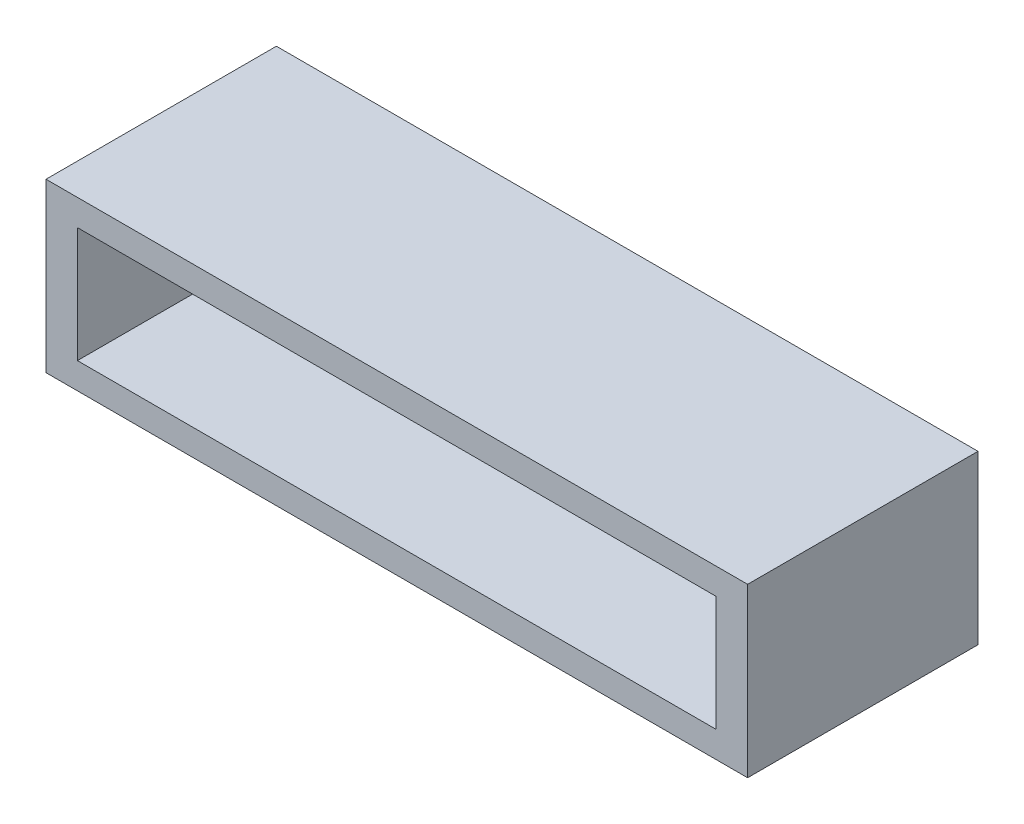
ISO-10303-21;
HEADER;
FILE_DESCRIPTION(('STEP AP214'),'2;1');
FILE_NAME('part.step','',(''),(''),'','','');
FILE_SCHEMA(('AUTOMOTIVE_DESIGN { 1 0 10303 214 1 1 1 1 }'));
ENDSEC;
DATA;
#1=APPLICATION_CONTEXT('core data for automotive mechanical design processes');
#2=APPLICATION_PROTOCOL_DEFINITION('international standard','automotive_design',2000,#1);
#3=PRODUCT_CONTEXT('',#1,'mechanical');
#4=PRODUCT('Part','Part','',(#3));
#5=PRODUCT_RELATED_PRODUCT_CATEGORY('part','',(#4));
#6=PRODUCT_DEFINITION_FORMATION('','',#4);
#7=PRODUCT_DEFINITION_CONTEXT('part definition',#1,'design');
#8=PRODUCT_DEFINITION('design','',#6,#7);
#9=PRODUCT_DEFINITION_SHAPE('','',#8);
#10=(LENGTH_UNIT() NAMED_UNIT(*) SI_UNIT(.MILLI.,.METRE.));
#11=(NAMED_UNIT(*) PLANE_ANGLE_UNIT() SI_UNIT($,.RADIAN.));
#12=(NAMED_UNIT(*) SI_UNIT($,.STERADIAN.) SOLID_ANGLE_UNIT());
#13=UNCERTAINTY_MEASURE_WITH_UNIT(LENGTH_MEASURE(1.E-05),#10,'distance_accuracy_value','');
#14=(GEOMETRIC_REPRESENTATION_CONTEXT(3) GLOBAL_UNCERTAINTY_ASSIGNED_CONTEXT((#13)) GLOBAL_UNIT_ASSIGNED_CONTEXT((#10,
#11,#12)) REPRESENTATION_CONTEXT('',''));
#15=CARTESIAN_POINT('',(0.,0.,0.));
#16=DIRECTION('',(0.,0.,1.));
#17=DIRECTION('',(1.,0.,0.));
#18=AXIS2_PLACEMENT_3D('',#15,#16,#17);
#19=CARTESIAN_POINT('',(0.,0.,22.));
#20=DIRECTION('',(0.,0.,1.));
#21=DIRECTION('',(1.,0.,0.));
#22=AXIS2_PLACEMENT_3D('',#19,#20,#21);
#23=PLANE('',#22);
#24=DIRECTION('',(0.,-1.,0.));
#25=VECTOR('',#24,1.);
#26=CARTESIAN_POINT('',(-33.5,-8.,22.));
#27=LINE('',#26,#25);
#28=CARTESIAN_POINT('',(-33.5,8.,22.));
#29=VERTEX_POINT('',#28);
#30=CARTESIAN_POINT('',(-33.5,-8.,22.));
#31=VERTEX_POINT('',#30);
#32=EDGE_CURVE('E138',#29,#31,#27,.T.);
#33=ORIENTED_EDGE('',*,*,#32,.T.);
#34=DIRECTION('',(1.,0.,0.));
#35=VECTOR('',#34,1.);
#36=CARTESIAN_POINT('',(33.5,-8.,22.));
#37=LINE('',#36,#35);
#38=CARTESIAN_POINT('',(33.5,-8.,22.));
#39=VERTEX_POINT('',#38);
#40=EDGE_CURVE('E141',#31,#39,#37,.T.);
#41=ORIENTED_EDGE('',*,*,#40,.T.);
#42=DIRECTION('',(0.,1.,0.));
#43=VECTOR('',#42,1.);
#44=CARTESIAN_POINT('',(33.5,-8.,22.));
#45=LINE('',#44,#43);
#46=CARTESIAN_POINT('',(33.5,8.,22.));
#47=VERTEX_POINT('',#46);
#48=EDGE_CURVE('E144',#39,#47,#45,.T.);
#49=ORIENTED_EDGE('',*,*,#48,.T.);
#50=DIRECTION('',(-1.,0.,0.));
#51=VECTOR('',#50,1.);
#52=CARTESIAN_POINT('',(33.5,8.,22.));
#53=LINE('',#52,#51);
#54=EDGE_CURVE('E146',#47,#29,#53,.T.);
#55=ORIENTED_EDGE('',*,*,#54,.T.);
#56=EDGE_LOOP('',(#33,#41,#49,#55));
#57=FACE_BOUND('',#56,.T.);
#58=DIRECTION('',(-1.,0.,0.));
#59=VECTOR('',#58,1.);
#60=CARTESIAN_POINT('',(-30.5,5.5,22.));
#61=LINE('',#60,#59);
#62=CARTESIAN_POINT('',(30.5,5.5,22.));
#63=VERTEX_POINT('',#62);
#64=CARTESIAN_POINT('',(-30.5,5.5,22.));
#65=VERTEX_POINT('',#64);
#66=EDGE_CURVE('E110',#63,#65,#61,.T.);
#67=ORIENTED_EDGE('',*,*,#66,.F.);
#68=DIRECTION('',(0.,1.,0.));
#69=VECTOR('',#68,1.);
#70=CARTESIAN_POINT('',(30.5,-5.5,22.));
#71=LINE('',#70,#69);
#72=CARTESIAN_POINT('',(30.5,-5.5,22.));
#73=VERTEX_POINT('',#72);
#74=EDGE_CURVE('E102',#73,#63,#71,.T.);
#75=ORIENTED_EDGE('',*,*,#74,.F.);
#76=DIRECTION('',(1.,0.,0.));
#77=VECTOR('',#76,1.);
#78=CARTESIAN_POINT('',(-30.5,-5.5,22.));
#79=LINE('',#78,#77);
#80=CARTESIAN_POINT('',(-30.5,-5.5,22.));
#81=VERTEX_POINT('',#80);
#82=EDGE_CURVE('E124',#81,#73,#79,.T.);
#83=ORIENTED_EDGE('',*,*,#82,.F.);
#84=DIRECTION('',(0.,-1.,0.));
#85=VECTOR('',#84,1.);
#86=CARTESIAN_POINT('',(-30.5,-5.5,22.));
#87=LINE('',#86,#85);
#88=EDGE_CURVE('E122',#65,#81,#87,.T.);
#89=ORIENTED_EDGE('',*,*,#88,.F.);
#90=EDGE_LOOP('',(#67,#75,#83,#89));
#91=FACE_BOUND('',#90,.T.);
#92=ADVANCED_FACE('F37',(#57,#91),#23,.T.);
#93=CARTESIAN_POINT('',(0.,0.,0.));
#94=DIRECTION('',(0.,0.,1.));
#95=DIRECTION('',(1.,0.,0.));
#96=AXIS2_PLACEMENT_3D('',#93,#94,#95);
#97=PLANE('',#96);
#98=DIRECTION('',(0.,-1.,0.));
#99=VECTOR('',#98,1.);
#100=CARTESIAN_POINT('',(-33.5,-8.,0.));
#101=LINE('',#100,#99);
#102=CARTESIAN_POINT('',(-33.5,8.,0.));
#103=VERTEX_POINT('',#102);
#104=CARTESIAN_POINT('',(-33.5,-8.,0.));
#105=VERTEX_POINT('',#104);
#106=EDGE_CURVE('E118',#103,#105,#101,.T.);
#107=ORIENTED_EDGE('',*,*,#106,.F.);
#108=DIRECTION('',(-1.,0.,0.));
#109=VECTOR('',#108,1.);
#110=CARTESIAN_POINT('',(33.5,8.,0.));
#111=LINE('',#110,#109);
#112=CARTESIAN_POINT('',(33.5,8.,0.));
#113=VERTEX_POINT('',#112);
#114=EDGE_CURVE('E142',#113,#103,#111,.T.);
#115=ORIENTED_EDGE('',*,*,#114,.F.);
#116=DIRECTION('',(0.,1.,0.));
#117=VECTOR('',#116,1.);
#118=CARTESIAN_POINT('',(33.5,-8.,0.));
#119=LINE('',#118,#117);
#120=CARTESIAN_POINT('',(33.5,-8.,0.));
#121=VERTEX_POINT('',#120);
#122=EDGE_CURVE('E153',#121,#113,#119,.T.);
#123=ORIENTED_EDGE('',*,*,#122,.F.);
#124=DIRECTION('',(1.,0.,0.));
#125=VECTOR('',#124,1.);
#126=CARTESIAN_POINT('',(33.5,-8.,0.));
#127=LINE('',#126,#125);
#128=EDGE_CURVE('E151',#105,#121,#127,.T.);
#129=ORIENTED_EDGE('',*,*,#128,.F.);
#130=EDGE_LOOP('',(#107,#115,#123,#129));
#131=FACE_BOUND('',#130,.T.);
#132=DIRECTION('',(0.,1.,0.));
#133=VECTOR('',#132,1.);
#134=CARTESIAN_POINT('',(30.5,-5.5,0.));
#135=LINE('',#134,#133);
#136=CARTESIAN_POINT('',(30.5,-5.5,0.));
#137=VERTEX_POINT('',#136);
#138=CARTESIAN_POINT('',(30.5,5.5,0.));
#139=VERTEX_POINT('',#138);
#140=EDGE_CURVE('E60',#137,#139,#135,.T.);
#141=ORIENTED_EDGE('',*,*,#140,.T.);
#142=DIRECTION('',(-1.,0.,0.));
#143=VECTOR('',#142,1.);
#144=CARTESIAN_POINT('',(-30.5,5.5,0.));
#145=LINE('',#144,#143);
#146=CARTESIAN_POINT('',(-30.5,5.5,0.));
#147=VERTEX_POINT('',#146);
#148=EDGE_CURVE('E117',#139,#147,#145,.T.);
#149=ORIENTED_EDGE('',*,*,#148,.T.);
#150=DIRECTION('',(0.,-1.,0.));
#151=VECTOR('',#150,1.);
#152=CARTESIAN_POINT('',(-30.5,-5.5,0.));
#153=LINE('',#152,#151);
#154=CARTESIAN_POINT('',(-30.5,-5.5,0.));
#155=VERTEX_POINT('',#154);
#156=EDGE_CURVE('E130',#147,#155,#153,.T.);
#157=ORIENTED_EDGE('',*,*,#156,.T.);
#158=DIRECTION('',(1.,0.,0.));
#159=VECTOR('',#158,1.);
#160=CARTESIAN_POINT('',(-30.5,-5.5,0.));
#161=LINE('',#160,#159);
#162=EDGE_CURVE('E111',#155,#137,#161,.T.);
#163=ORIENTED_EDGE('',*,*,#162,.T.);
#164=EDGE_LOOP('',(#141,#149,#157,#163));
#165=FACE_BOUND('',#164,.T.);
#166=ADVANCED_FACE('F171',(#131,#165),#97,.F.);
#167=CARTESIAN_POINT('',(-33.5,-8.,22.));
#168=DIRECTION('',(1.,0.,0.));
#169=DIRECTION('',(0.,0.,-1.));
#170=AXIS2_PLACEMENT_3D('',#167,#168,#169);
#171=PLANE('',#170);
#172=ORIENTED_EDGE('',*,*,#106,.T.);
#173=DIRECTION('',(0.,0.,-1.));
#174=VECTOR('',#173,1.);
#175=CARTESIAN_POINT('',(-33.5,-8.,22.));
#176=LINE('',#175,#174);
#177=EDGE_CURVE('E11',#31,#105,#176,.T.);
#178=ORIENTED_EDGE('',*,*,#177,.F.);
#179=ORIENTED_EDGE('',*,*,#32,.F.);
#180=DIRECTION('',(0.,0.,-1.));
#181=VECTOR('',#180,1.);
#182=CARTESIAN_POINT('',(-33.5,8.,22.));
#183=LINE('',#182,#181);
#184=EDGE_CURVE('E148',#29,#103,#183,.T.);
#185=ORIENTED_EDGE('',*,*,#184,.T.);
#186=EDGE_LOOP('',(#172,#178,#179,#185));
#187=FACE_BOUND('',#186,.T.);
#188=ADVANCED_FACE('F39',(#187),#171,.F.);
#189=CARTESIAN_POINT('',(33.5,-8.,22.));
#190=DIRECTION('',(0.,1.,0.));
#191=DIRECTION('',(0.,0.,1.));
#192=AXIS2_PLACEMENT_3D('',#189,#190,#191);
#193=PLANE('',#192);
#194=ORIENTED_EDGE('',*,*,#128,.T.);
#195=DIRECTION('',(0.,0.,-1.));
#196=VECTOR('',#195,1.);
#197=CARTESIAN_POINT('',(33.5,-8.,22.));
#198=LINE('',#197,#196);
#199=EDGE_CURVE('E45',#39,#121,#198,.T.);
#200=ORIENTED_EDGE('',*,*,#199,.F.);
#201=ORIENTED_EDGE('',*,*,#40,.F.);
#202=ORIENTED_EDGE('',*,*,#177,.T.);
#203=EDGE_LOOP('',(#194,#200,#201,#202));
#204=FACE_BOUND('',#203,.T.);
#205=ADVANCED_FACE('F181',(#204),#193,.F.);
#206=CARTESIAN_POINT('',(33.5,-8.,22.));
#207=DIRECTION('',(-1.,0.,0.));
#208=DIRECTION('',(0.,0.,1.));
#209=AXIS2_PLACEMENT_3D('',#206,#207,#208);
#210=PLANE('',#209);
#211=ORIENTED_EDGE('',*,*,#122,.T.);
#212=DIRECTION('',(0.,0.,-1.));
#213=VECTOR('',#212,1.);
#214=CARTESIAN_POINT('',(33.5,8.,22.));
#215=LINE('',#214,#213);
#216=EDGE_CURVE('E158',#47,#113,#215,.T.);
#217=ORIENTED_EDGE('',*,*,#216,.F.);
#218=ORIENTED_EDGE('',*,*,#48,.F.);
#219=ORIENTED_EDGE('',*,*,#199,.T.);
#220=EDGE_LOOP('',(#211,#217,#218,#219));
#221=FACE_BOUND('',#220,.T.);
#222=ADVANCED_FACE('F165',(#221),#210,.F.);
#223=CARTESIAN_POINT('',(33.5,8.,22.));
#224=DIRECTION('',(0.,-1.,0.));
#225=DIRECTION('',(0.,0.,-1.));
#226=AXIS2_PLACEMENT_3D('',#223,#224,#225);
#227=PLANE('',#226);
#228=ORIENTED_EDGE('',*,*,#114,.T.);
#229=ORIENTED_EDGE('',*,*,#184,.F.);
#230=ORIENTED_EDGE('',*,*,#54,.F.);
#231=ORIENTED_EDGE('',*,*,#216,.T.);
#232=EDGE_LOOP('',(#228,#229,#230,#231));
#233=FACE_BOUND('',#232,.T.);
#234=ADVANCED_FACE('F175',(#233),#227,.F.);
#235=CARTESIAN_POINT('',(30.5,-5.5,22.));
#236=DIRECTION('',(-1.,0.,0.));
#237=DIRECTION('',(0.,0.,1.));
#238=AXIS2_PLACEMENT_3D('',#235,#236,#237);
#239=PLANE('',#238);
#240=ORIENTED_EDGE('',*,*,#140,.F.);
#241=DIRECTION('',(0.,0.,-1.));
#242=VECTOR('',#241,1.);
#243=CARTESIAN_POINT('',(30.5,-5.5,22.));
#244=LINE('',#243,#242);
#245=EDGE_CURVE('E106',#73,#137,#244,.T.);
#246=ORIENTED_EDGE('',*,*,#245,.F.);
#247=ORIENTED_EDGE('',*,*,#74,.T.);
#248=DIRECTION('',(0.,0.,-1.));
#249=VECTOR('',#248,1.);
#250=CARTESIAN_POINT('',(30.5,5.5,22.));
#251=LINE('',#250,#249);
#252=EDGE_CURVE('E105',#63,#139,#251,.T.);
#253=ORIENTED_EDGE('',*,*,#252,.T.);
#254=EDGE_LOOP('',(#240,#246,#247,#253));
#255=FACE_BOUND('',#254,.T.);
#256=ADVANCED_FACE('F104',(#255),#239,.T.);
#257=CARTESIAN_POINT('',(-30.5,5.5,22.));
#258=DIRECTION('',(0.,-1.,0.));
#259=DIRECTION('',(0.,0.,-1.));
#260=AXIS2_PLACEMENT_3D('',#257,#258,#259);
#261=PLANE('',#260);
#262=ORIENTED_EDGE('',*,*,#148,.F.);
#263=ORIENTED_EDGE('',*,*,#252,.F.);
#264=ORIENTED_EDGE('',*,*,#66,.T.);
#265=DIRECTION('',(0.,0.,-1.));
#266=VECTOR('',#265,1.);
#267=CARTESIAN_POINT('',(-30.5,5.5,22.));
#268=LINE('',#267,#266);
#269=EDGE_CURVE('E119',#65,#147,#268,.T.);
#270=ORIENTED_EDGE('',*,*,#269,.T.);
#271=EDGE_LOOP('',(#262,#263,#264,#270));
#272=FACE_BOUND('',#271,.T.);
#273=ADVANCED_FACE('F114',(#272),#261,.T.);
#274=CARTESIAN_POINT('',(-30.5,-5.5,22.));
#275=DIRECTION('',(1.,0.,0.));
#276=DIRECTION('',(0.,0.,-1.));
#277=AXIS2_PLACEMENT_3D('',#274,#275,#276);
#278=PLANE('',#277);
#279=ORIENTED_EDGE('',*,*,#156,.F.);
#280=ORIENTED_EDGE('',*,*,#269,.F.);
#281=ORIENTED_EDGE('',*,*,#88,.T.);
#282=DIRECTION('',(0.,0.,-1.));
#283=VECTOR('',#282,1.);
#284=CARTESIAN_POINT('',(-30.5,-5.5,22.));
#285=LINE('',#284,#283);
#286=EDGE_CURVE('E52',#81,#155,#285,.T.);
#287=ORIENTED_EDGE('',*,*,#286,.T.);
#288=EDGE_LOOP('',(#279,#280,#281,#287));
#289=FACE_BOUND('',#288,.T.);
#290=ADVANCED_FACE('F204',(#289),#278,.T.);
#291=CARTESIAN_POINT('',(-30.5,-5.5,22.));
#292=DIRECTION('',(0.,1.,0.));
#293=DIRECTION('',(0.,0.,1.));
#294=AXIS2_PLACEMENT_3D('',#291,#292,#293);
#295=PLANE('',#294);
#296=ORIENTED_EDGE('',*,*,#162,.F.);
#297=ORIENTED_EDGE('',*,*,#286,.F.);
#298=ORIENTED_EDGE('',*,*,#82,.T.);
#299=ORIENTED_EDGE('',*,*,#245,.T.);
#300=EDGE_LOOP('',(#296,#297,#298,#299));
#301=FACE_BOUND('',#300,.T.);
#302=ADVANCED_FACE('F208',(#301),#295,.T.);
#303=CLOSED_SHELL('',(#92,#166,#188,#205,#222,#234,#256,#273,#290,#302));
#304=MANIFOLD_SOLID_BREP('B2',#303);
#305=ADVANCED_BREP_SHAPE_REPRESENTATION('',(#18,#304),#14);
#306=SHAPE_DEFINITION_REPRESENTATION(#9,#305);
ENDSEC;
END-ISO-10303-21;
